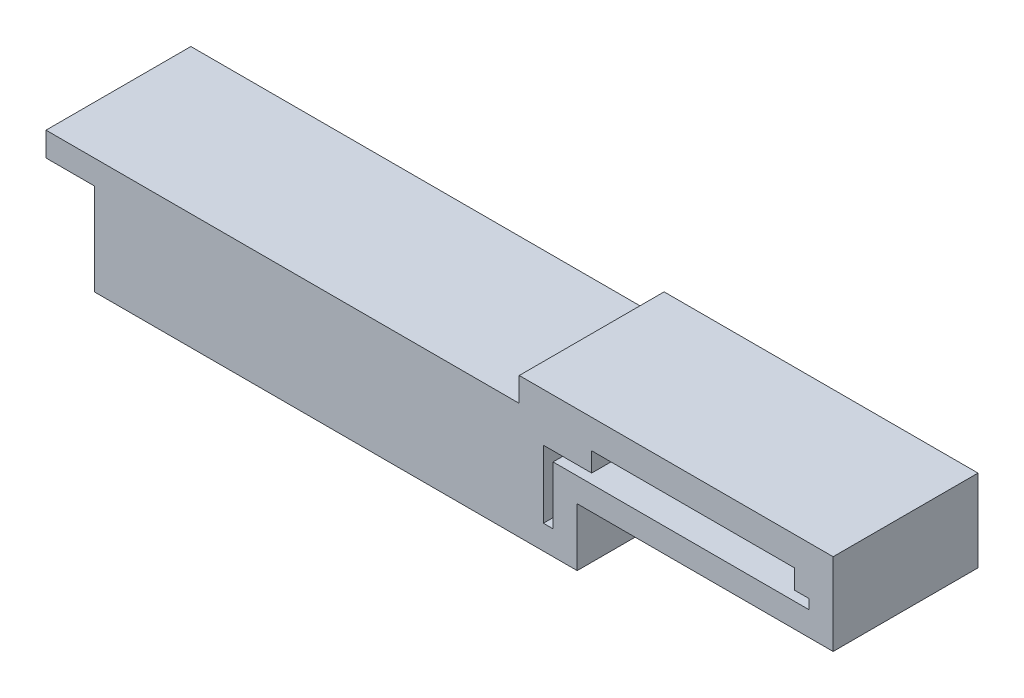
ISO-10303-21;
HEADER;
FILE_DESCRIPTION(('STEP AP214'),'2;1');
FILE_NAME('part.step','',(''),(''),'','','');
FILE_SCHEMA(('AUTOMOTIVE_DESIGN { 1 0 10303 214 1 1 1 1 }'));
ENDSEC;
DATA;
#1=APPLICATION_CONTEXT('core data for automotive mechanical design processes');
#2=APPLICATION_PROTOCOL_DEFINITION('international standard','automotive_design',2000,#1);
#3=PRODUCT_CONTEXT('',#1,'mechanical');
#4=PRODUCT('Part','Part','',(#3));
#5=PRODUCT_RELATED_PRODUCT_CATEGORY('part','',(#4));
#6=PRODUCT_DEFINITION_FORMATION('','',#4);
#7=PRODUCT_DEFINITION_CONTEXT('part definition',#1,'design');
#8=PRODUCT_DEFINITION('design','',#6,#7);
#9=PRODUCT_DEFINITION_SHAPE('','',#8);
#10=(LENGTH_UNIT() NAMED_UNIT(*) SI_UNIT(.MILLI.,.METRE.));
#11=(NAMED_UNIT(*) PLANE_ANGLE_UNIT() SI_UNIT($,.RADIAN.));
#12=(NAMED_UNIT(*) SI_UNIT($,.STERADIAN.) SOLID_ANGLE_UNIT());
#13=UNCERTAINTY_MEASURE_WITH_UNIT(LENGTH_MEASURE(1.E-05),#10,'distance_accuracy_value','');
#14=(GEOMETRIC_REPRESENTATION_CONTEXT(3) GLOBAL_UNCERTAINTY_ASSIGNED_CONTEXT((#13)) GLOBAL_UNIT_ASSIGNED_CONTEXT((#10,
#11,#12)) REPRESENTATION_CONTEXT('',''));
#15=CARTESIAN_POINT('',(0.,0.,0.));
#16=DIRECTION('',(0.,0.,1.));
#17=DIRECTION('',(1.,0.,0.));
#18=AXIS2_PLACEMENT_3D('',#15,#16,#17);
#19=CARTESIAN_POINT('',(10.,0.,30.));
#20=DIRECTION('',(1.,0.,0.));
#21=DIRECTION('',(0.,0.,-1.));
#22=AXIS2_PLACEMENT_3D('',#19,#20,#21);
#23=PLANE('',#22);
#24=DIRECTION('',(0.,-1.,0.));
#25=VECTOR('',#24,1.);
#26=CARTESIAN_POINT('',(10.,0.,0.));
#27=LINE('',#26,#25);
#28=CARTESIAN_POINT('',(10.,18.,0.));
#29=VERTEX_POINT('',#28);
#30=CARTESIAN_POINT('',(10.,14.,0.));
#31=VERTEX_POINT('',#30);
#32=EDGE_CURVE('E225',#29,#31,#27,.T.);
#33=ORIENTED_EDGE('',*,*,#32,.F.);
#34=DIRECTION('',(0.,0.,-1.));
#35=VECTOR('',#34,1.);
#36=CARTESIAN_POINT('',(10.,18.,30.));
#37=LINE('',#36,#35);
#38=CARTESIAN_POINT('',(10.,18.,30.));
#39=VERTEX_POINT('',#38);
#40=EDGE_CURVE('E11',#39,#29,#37,.T.);
#41=ORIENTED_EDGE('',*,*,#40,.F.);
#42=DIRECTION('',(0.,-1.,0.));
#43=VECTOR('',#42,1.);
#44=CARTESIAN_POINT('',(10.,0.,30.));
#45=LINE('',#44,#43);
#46=CARTESIAN_POINT('',(10.,14.,30.));
#47=VERTEX_POINT('',#46);
#48=EDGE_CURVE('E323',#39,#47,#45,.T.);
#49=ORIENTED_EDGE('',*,*,#48,.T.);
#50=DIRECTION('',(0.,0.,-1.));
#51=VECTOR('',#50,1.);
#52=CARTESIAN_POINT('',(10.,14.,30.));
#53=LINE('',#52,#51);
#54=EDGE_CURVE('E68',#47,#31,#53,.T.);
#55=ORIENTED_EDGE('',*,*,#54,.T.);
#56=EDGE_LOOP('',(#33,#41,#49,#55));
#57=FACE_BOUND('',#56,.T.);
#58=ADVANCED_FACE('F41',(#57),#23,.T.);
#59=CARTESIAN_POINT('',(0.,18.,30.));
#60=DIRECTION('',(0.,-1.,0.));
#61=DIRECTION('',(1.,0.,0.));
#62=AXIS2_PLACEMENT_3D('',#59,#60,#61);
#63=PLANE('',#62);
#64=DIRECTION('',(-1.,0.,0.));
#65=VECTOR('',#64,1.);
#66=CARTESIAN_POINT('',(0.,18.,0.));
#67=LINE('',#66,#65);
#68=CARTESIAN_POINT('',(52.,18.,0.));
#69=VERTEX_POINT('',#68);
#70=EDGE_CURVE('E228',#69,#29,#67,.T.);
#71=ORIENTED_EDGE('',*,*,#70,.F.);
#72=DIRECTION('',(0.,0.,-1.));
#73=VECTOR('',#72,1.);
#74=CARTESIAN_POINT('',(52.,18.,30.));
#75=LINE('',#74,#73);
#76=CARTESIAN_POINT('',(52.,18.,30.));
#77=VERTEX_POINT('',#76);
#78=EDGE_CURVE('E51',#77,#69,#75,.T.);
#79=ORIENTED_EDGE('',*,*,#78,.F.);
#80=DIRECTION('',(-1.,0.,0.));
#81=VECTOR('',#80,1.);
#82=CARTESIAN_POINT('',(0.,18.,30.));
#83=LINE('',#82,#81);
#84=EDGE_CURVE('E330',#77,#39,#83,.T.);
#85=ORIENTED_EDGE('',*,*,#84,.T.);
#86=ORIENTED_EDGE('',*,*,#40,.T.);
#87=EDGE_LOOP('',(#71,#79,#85,#86));
#88=FACE_BOUND('',#87,.T.);
#89=ADVANCED_FACE('F380',(#88),#63,.T.);
#90=CARTESIAN_POINT('',(52.,0.,30.));
#91=DIRECTION('',(-1.,0.,0.));
#92=DIRECTION('',(0.,0.,1.));
#93=AXIS2_PLACEMENT_3D('',#90,#91,#92);
#94=PLANE('',#93);
#95=DIRECTION('',(0.,1.,0.));
#96=VECTOR('',#95,1.);
#97=CARTESIAN_POINT('',(52.,0.,0.));
#98=LINE('',#97,#96);
#99=CARTESIAN_POINT('',(52.,14.,0.));
#100=VERTEX_POINT('',#99);
#101=EDGE_CURVE('E232',#100,#69,#98,.T.);
#102=ORIENTED_EDGE('',*,*,#101,.F.);
#103=DIRECTION('',(0.,0.,-1.));
#104=VECTOR('',#103,1.);
#105=CARTESIAN_POINT('',(52.,14.,30.));
#106=LINE('',#105,#104);
#107=CARTESIAN_POINT('',(52.,14.,30.));
#108=VERTEX_POINT('',#107);
#109=EDGE_CURVE('E273',#108,#100,#106,.T.);
#110=ORIENTED_EDGE('',*,*,#109,.F.);
#111=DIRECTION('',(0.,1.,0.));
#112=VECTOR('',#111,1.);
#113=CARTESIAN_POINT('',(52.,0.,30.));
#114=LINE('',#113,#112);
#115=EDGE_CURVE('E334',#108,#77,#114,.T.);
#116=ORIENTED_EDGE('',*,*,#115,.T.);
#117=ORIENTED_EDGE('',*,*,#78,.T.);
#118=EDGE_LOOP('',(#102,#110,#116,#117));
#119=FACE_BOUND('',#118,.T.);
#120=ADVANCED_FACE('F385',(#119),#94,.T.);
#121=CARTESIAN_POINT('',(0.,14.,30.));
#122=DIRECTION('',(0.,-1.,0.));
#123=DIRECTION('',(1.,0.,0.));
#124=AXIS2_PLACEMENT_3D('',#121,#122,#123);
#125=PLANE('',#124);
#126=DIRECTION('',(-1.,0.,0.));
#127=VECTOR('',#126,1.);
#128=CARTESIAN_POINT('',(0.,14.,0.));
#129=LINE('',#128,#127);
#130=CARTESIAN_POINT('',(55.,14.,0.));
#131=VERTEX_POINT('',#130);
#132=EDGE_CURVE('E236',#131,#100,#129,.T.);
#133=ORIENTED_EDGE('',*,*,#132,.F.);
#134=DIRECTION('',(0.,0.,-1.));
#135=VECTOR('',#134,1.);
#136=CARTESIAN_POINT('',(55.,14.,30.));
#137=LINE('',#136,#135);
#138=CARTESIAN_POINT('',(55.,14.,30.));
#139=VERTEX_POINT('',#138);
#140=EDGE_CURVE('E270',#139,#131,#137,.T.);
#141=ORIENTED_EDGE('',*,*,#140,.F.);
#142=DIRECTION('',(-1.,0.,0.));
#143=VECTOR('',#142,1.);
#144=CARTESIAN_POINT('',(0.,14.,30.));
#145=LINE('',#144,#143);
#146=EDGE_CURVE('E200',#139,#108,#145,.T.);
#147=ORIENTED_EDGE('',*,*,#146,.T.);
#148=ORIENTED_EDGE('',*,*,#109,.T.);
#149=EDGE_LOOP('',(#133,#141,#147,#148));
#150=FACE_BOUND('',#149,.T.);
#151=ADVANCED_FACE('F377',(#150),#125,.T.);
#152=CARTESIAN_POINT('',(55.,0.,30.));
#153=DIRECTION('',(-1.,0.,0.));
#154=DIRECTION('',(0.,0.,1.));
#155=AXIS2_PLACEMENT_3D('',#152,#153,#154);
#156=PLANE('',#155);
#157=DIRECTION('',(0.,1.,0.));
#158=VECTOR('',#157,1.);
#159=CARTESIAN_POINT('',(55.,0.,0.));
#160=LINE('',#159,#158);
#161=CARTESIAN_POINT('',(55.,12.,0.));
#162=VERTEX_POINT('',#161);
#163=EDGE_CURVE('E240',#162,#131,#160,.T.);
#164=ORIENTED_EDGE('',*,*,#163,.F.);
#165=DIRECTION('',(0.,0.,-1.));
#166=VECTOR('',#165,1.);
#167=CARTESIAN_POINT('',(55.,12.,30.));
#168=LINE('',#167,#166);
#169=CARTESIAN_POINT('',(55.,12.,30.));
#170=VERTEX_POINT('',#169);
#171=EDGE_CURVE('E267',#170,#162,#168,.T.);
#172=ORIENTED_EDGE('',*,*,#171,.F.);
#173=DIRECTION('',(0.,1.,0.));
#174=VECTOR('',#173,1.);
#175=CARTESIAN_POINT('',(55.,0.,30.));
#176=LINE('',#175,#174);
#177=EDGE_CURVE('E340',#170,#139,#176,.T.);
#178=ORIENTED_EDGE('',*,*,#177,.T.);
#179=ORIENTED_EDGE('',*,*,#140,.T.);
#180=EDGE_LOOP('',(#164,#172,#178,#179));
#181=FACE_BOUND('',#180,.T.);
#182=ADVANCED_FACE('F602',(#181),#156,.T.);
#183=CARTESIAN_POINT('',(0.,12.,30.));
#184=DIRECTION('',(0.,1.,0.));
#185=DIRECTION('',(-1.,0.,0.));
#186=AXIS2_PLACEMENT_3D('',#183,#184,#185);
#187=PLANE('',#186);
#188=DIRECTION('',(1.,0.,0.));
#189=VECTOR('',#188,1.);
#190=CARTESIAN_POINT('',(0.,12.,0.));
#191=LINE('',#190,#189);
#192=CARTESIAN_POINT('',(2.,12.,0.));
#193=VERTEX_POINT('',#192);
#194=EDGE_CURVE('E245',#193,#162,#191,.T.);
#195=ORIENTED_EDGE('',*,*,#194,.F.);
#196=DIRECTION('',(0.,0.,-1.));
#197=VECTOR('',#196,1.);
#198=CARTESIAN_POINT('',(2.,12.,30.));
#199=LINE('',#198,#197);
#200=CARTESIAN_POINT('',(2.,12.,30.));
#201=VERTEX_POINT('',#200);
#202=EDGE_CURVE('E264',#201,#193,#199,.T.);
#203=ORIENTED_EDGE('',*,*,#202,.F.);
#204=DIRECTION('',(1.,0.,0.));
#205=VECTOR('',#204,1.);
#206=CARTESIAN_POINT('',(0.,12.,30.));
#207=LINE('',#206,#205);
#208=EDGE_CURVE('E344',#201,#170,#207,.T.);
#209=ORIENTED_EDGE('',*,*,#208,.T.);
#210=ORIENTED_EDGE('',*,*,#171,.T.);
#211=EDGE_LOOP('',(#195,#203,#209,#210));
#212=FACE_BOUND('',#211,.T.);
#213=ADVANCED_FACE('F593',(#212),#187,.T.);
#214=CARTESIAN_POINT('',(2.,0.,30.));
#215=DIRECTION('',(-1.,0.,0.));
#216=DIRECTION('',(0.,0.,1.));
#217=AXIS2_PLACEMENT_3D('',#214,#215,#216);
#218=PLANE('',#217);
#219=DIRECTION('',(0.,1.,0.));
#220=VECTOR('',#219,1.);
#221=CARTESIAN_POINT('',(2.,0.,0.));
#222=LINE('',#221,#220);
#223=CARTESIAN_POINT('',(2.,0.,0.));
#224=VERTEX_POINT('',#223);
#225=EDGE_CURVE('E249',#224,#193,#222,.T.);
#226=ORIENTED_EDGE('',*,*,#225,.F.);
#227=DIRECTION('',(0.,0.,-1.));
#228=VECTOR('',#227,1.);
#229=CARTESIAN_POINT('',(2.,0.,30.));
#230=LINE('',#229,#228);
#231=CARTESIAN_POINT('',(2.,0.,30.));
#232=VERTEX_POINT('',#231);
#233=EDGE_CURVE('E178',#232,#224,#230,.T.);
#234=ORIENTED_EDGE('',*,*,#233,.F.);
#235=DIRECTION('',(0.,1.,0.));
#236=VECTOR('',#235,1.);
#237=CARTESIAN_POINT('',(2.,0.,30.));
#238=LINE('',#237,#236);
#239=EDGE_CURVE('E190',#232,#201,#238,.T.);
#240=ORIENTED_EDGE('',*,*,#239,.T.);
#241=ORIENTED_EDGE('',*,*,#202,.T.);
#242=EDGE_LOOP('',(#226,#234,#240,#241));
#243=FACE_BOUND('',#242,.T.);
#244=ADVANCED_FACE('F350',(#243),#218,.T.);
#245=CARTESIAN_POINT('',(0.,0.,30.));
#246=DIRECTION('',(0.,1.,0.));
#247=DIRECTION('',(0.,0.,1.));
#248=AXIS2_PLACEMENT_3D('',#245,#246,#247);
#249=PLANE('',#248);
#250=DIRECTION('',(1.,0.,0.));
#251=VECTOR('',#250,1.);
#252=CARTESIAN_POINT('',(0.,0.,0.));
#253=LINE('',#252,#251);
#254=CARTESIAN_POINT('',(0.,0.,0.));
#255=VERTEX_POINT('',#254);
#256=EDGE_CURVE('E172',#255,#224,#253,.T.);
#257=ORIENTED_EDGE('',*,*,#256,.F.);
#258=DIRECTION('',(0.,0.,-1.));
#259=VECTOR('',#258,1.);
#260=CARTESIAN_POINT('',(0.,0.,30.));
#261=LINE('',#260,#259);
#262=CARTESIAN_POINT('',(0.,0.,30.));
#263=VERTEX_POINT('',#262);
#264=EDGE_CURVE('E167',#263,#255,#261,.T.);
#265=ORIENTED_EDGE('',*,*,#264,.F.);
#266=DIRECTION('',(1.,0.,0.));
#267=VECTOR('',#266,1.);
#268=CARTESIAN_POINT('',(0.,0.,30.));
#269=LINE('',#268,#267);
#270=EDGE_CURVE('E170',#263,#232,#269,.T.);
#271=ORIENTED_EDGE('',*,*,#270,.T.);
#272=ORIENTED_EDGE('',*,*,#233,.T.);
#273=EDGE_LOOP('',(#257,#265,#271,#272));
#274=FACE_BOUND('',#273,.T.);
#275=ADVANCED_FACE('F169',(#274),#249,.T.);
#276=CARTESIAN_POINT('',(0.,0.,30.));
#277=DIRECTION('',(1.,0.,0.));
#278=DIRECTION('',(0.,1.,0.));
#279=AXIS2_PLACEMENT_3D('',#276,#277,#278);
#280=PLANE('',#279);
#281=DIRECTION('',(0.,-1.,0.));
#282=VECTOR('',#281,1.);
#283=CARTESIAN_POINT('',(0.,0.,0.));
#284=LINE('',#283,#282);
#285=CARTESIAN_POINT('',(0.,14.,0.));
#286=VERTEX_POINT('',#285);
#287=EDGE_CURVE('E255',#286,#255,#284,.T.);
#288=ORIENTED_EDGE('',*,*,#287,.F.);
#289=DIRECTION('',(0.,0.,-1.));
#290=VECTOR('',#289,1.);
#291=CARTESIAN_POINT('',(0.,14.,30.));
#292=LINE('',#291,#290);
#293=CARTESIAN_POINT('',(0.,14.,30.));
#294=VERTEX_POINT('',#293);
#295=EDGE_CURVE('E179',#294,#286,#292,.T.);
#296=ORIENTED_EDGE('',*,*,#295,.F.);
#297=DIRECTION('',(0.,-1.,0.));
#298=VECTOR('',#297,1.);
#299=CARTESIAN_POINT('',(0.,0.,30.));
#300=LINE('',#299,#298);
#301=EDGE_CURVE('E187',#294,#263,#300,.T.);
#302=ORIENTED_EDGE('',*,*,#301,.T.);
#303=ORIENTED_EDGE('',*,*,#264,.T.);
#304=EDGE_LOOP('',(#288,#296,#302,#303));
#305=FACE_BOUND('',#304,.T.);
#306=ADVANCED_FACE('F193',(#305),#280,.T.);
#307=CARTESIAN_POINT('',(-5.,0.,30.));
#308=DIRECTION('',(-1.,0.,0.));
#309=DIRECTION('',(0.,0.,1.));
#310=AXIS2_PLACEMENT_3D('',#307,#308,#309);
#311=PLANE('',#310);
#312=DIRECTION('',(0.,0.,-1.));
#313=VECTOR('',#312,1.);
#314=CARTESIAN_POINT('',(-5.,19.,30.));
#315=LINE('',#314,#313);
#316=CARTESIAN_POINT('',(-5.,19.,30.));
#317=VERTEX_POINT('',#316);
#318=CARTESIAN_POINT('',(-5.,19.,0.));
#319=VERTEX_POINT('',#318);
#320=EDGE_CURVE('E59',#317,#319,#315,.T.);
#321=ORIENTED_EDGE('',*,*,#320,.F.);
#322=DIRECTION('',(0.,1.,0.));
#323=VECTOR('',#322,1.);
#324=CARTESIAN_POINT('',(-5.,0.,30.));
#325=LINE('',#324,#323);
#326=CARTESIAN_POINT('',(-5.,24.,30.));
#327=VERTEX_POINT('',#326);
#328=EDGE_CURVE('E354',#317,#327,#325,.T.);
#329=ORIENTED_EDGE('',*,*,#328,.T.);
#330=DIRECTION('',(0.,0.,-1.));
#331=VECTOR('',#330,1.);
#332=CARTESIAN_POINT('',(-5.,24.,30.));
#333=LINE('',#332,#331);
#334=CARTESIAN_POINT('',(-5.,24.,0.));
#335=VERTEX_POINT('',#334);
#336=EDGE_CURVE('E198',#327,#335,#333,.T.);
#337=ORIENTED_EDGE('',*,*,#336,.T.);
#338=DIRECTION('',(0.,1.,0.));
#339=VECTOR('',#338,1.);
#340=CARTESIAN_POINT('',(-5.,0.,0.));
#341=LINE('',#340,#339);
#342=EDGE_CURVE('E203',#319,#335,#341,.T.);
#343=ORIENTED_EDGE('',*,*,#342,.F.);
#344=EDGE_LOOP('',(#321,#329,#337,#343));
#345=FACE_BOUND('',#344,.T.);
#346=ADVANCED_FACE('F43',(#345),#311,.T.);
#347=CARTESIAN_POINT('',(0.,-5.,30.));
#348=DIRECTION('',(0.,1.,0.));
#349=DIRECTION('',(0.,0.,1.));
#350=AXIS2_PLACEMENT_3D('',#347,#348,#349);
#351=PLANE('',#350);
#352=DIRECTION('',(1.,0.,0.));
#353=VECTOR('',#352,1.);
#354=CARTESIAN_POINT('',(0.,-5.,0.));
#355=LINE('',#354,#353);
#356=CARTESIAN_POINT('',(-93.,-5.,0.));
#357=VERTEX_POINT('',#356);
#358=CARTESIAN_POINT('',(7.,-5.,0.));
#359=VERTEX_POINT('',#358);
#360=EDGE_CURVE('E206',#357,#359,#355,.T.);
#361=ORIENTED_EDGE('',*,*,#360,.T.);
#362=DIRECTION('',(0.,0.,-1.));
#363=VECTOR('',#362,1.);
#364=CARTESIAN_POINT('',(7.,-5.,30.));
#365=LINE('',#364,#363);
#366=CARTESIAN_POINT('',(7.,-5.,30.));
#367=VERTEX_POINT('',#366);
#368=EDGE_CURVE('E45',#367,#359,#365,.T.);
#369=ORIENTED_EDGE('',*,*,#368,.F.);
#370=DIRECTION('',(1.,0.,0.));
#371=VECTOR('',#370,1.);
#372=CARTESIAN_POINT('',(0.,-5.,30.));
#373=LINE('',#372,#371);
#374=CARTESIAN_POINT('',(-93.,-5.,30.));
#375=VERTEX_POINT('',#374);
#376=EDGE_CURVE('E128',#375,#367,#373,.T.);
#377=ORIENTED_EDGE('',*,*,#376,.F.);
#378=DIRECTION('',(0.,0.,-1.));
#379=VECTOR('',#378,1.);
#380=CARTESIAN_POINT('',(-93.,-5.,30.));
#381=LINE('',#380,#379);
#382=EDGE_CURVE('E207',#375,#357,#381,.T.);
#383=ORIENTED_EDGE('',*,*,#382,.T.);
#384=EDGE_LOOP('',(#361,#369,#377,#383));
#385=FACE_BOUND('',#384,.T.);
#386=ADVANCED_FACE('F398',(#385),#351,.F.);
#387=CARTESIAN_POINT('',(7.,0.,30.));
#388=DIRECTION('',(-1.,0.,0.));
#389=DIRECTION('',(0.,-1.,0.));
#390=AXIS2_PLACEMENT_3D('',#387,#388,#389);
#391=PLANE('',#390);
#392=DIRECTION('',(0.,1.,0.));
#393=VECTOR('',#392,1.);
#394=CARTESIAN_POINT('',(7.,0.,0.));
#395=LINE('',#394,#393);
#396=CARTESIAN_POINT('',(7.,7.00000000000001,0.));
#397=VERTEX_POINT('',#396);
#398=EDGE_CURVE('E210',#359,#397,#395,.T.);
#399=ORIENTED_EDGE('',*,*,#398,.T.);
#400=DIRECTION('',(0.,0.,-1.));
#401=VECTOR('',#400,1.);
#402=CARTESIAN_POINT('',(7.,7.00000000000001,30.));
#403=LINE('',#402,#401);
#404=CARTESIAN_POINT('',(7.,7.00000000000001,30.));
#405=VERTEX_POINT('',#404);
#406=EDGE_CURVE('E286',#405,#397,#403,.T.);
#407=ORIENTED_EDGE('',*,*,#406,.F.);
#408=DIRECTION('',(0.,1.,0.));
#409=VECTOR('',#408,1.);
#410=CARTESIAN_POINT('',(7.,0.,30.));
#411=LINE('',#410,#409);
#412=EDGE_CURVE('E299',#367,#405,#411,.T.);
#413=ORIENTED_EDGE('',*,*,#412,.F.);
#414=ORIENTED_EDGE('',*,*,#368,.T.);
#415=EDGE_LOOP('',(#399,#407,#413,#414));
#416=FACE_BOUND('',#415,.T.);
#417=ADVANCED_FACE('F298',(#416),#391,.F.);
#418=CARTESIAN_POINT('',(0.,7.00000000000001,30.));
#419=DIRECTION('',(0.,1.,0.));
#420=DIRECTION('',(0.,0.,1.));
#421=AXIS2_PLACEMENT_3D('',#418,#419,#420);
#422=PLANE('',#421);
#423=DIRECTION('',(1.,0.,0.));
#424=VECTOR('',#423,1.);
#425=CARTESIAN_POINT('',(0.,7.00000000000001,0.));
#426=LINE('',#425,#424);
#427=CARTESIAN_POINT('',(60.,7.00000000000001,0.));
#428=VERTEX_POINT('',#427);
#429=EDGE_CURVE('E213',#397,#428,#426,.T.);
#430=ORIENTED_EDGE('',*,*,#429,.T.);
#431=DIRECTION('',(0.,0.,-1.));
#432=VECTOR('',#431,1.);
#433=CARTESIAN_POINT('',(60.,7.00000000000001,30.));
#434=LINE('',#433,#432);
#435=CARTESIAN_POINT('',(60.,7.00000000000001,30.));
#436=VERTEX_POINT('',#435);
#437=EDGE_CURVE('E284',#436,#428,#434,.T.);
#438=ORIENTED_EDGE('',*,*,#437,.F.);
#439=DIRECTION('',(1.,0.,0.));
#440=VECTOR('',#439,1.);
#441=CARTESIAN_POINT('',(0.,7.00000000000001,30.));
#442=LINE('',#441,#440);
#443=EDGE_CURVE('E311',#405,#436,#442,.T.);
#444=ORIENTED_EDGE('',*,*,#443,.F.);
#445=ORIENTED_EDGE('',*,*,#406,.T.);
#446=EDGE_LOOP('',(#430,#438,#444,#445));
#447=FACE_BOUND('',#446,.T.);
#448=ADVANCED_FACE('F309',(#447),#422,.F.);
#449=CARTESIAN_POINT('',(60.,0.,30.));
#450=DIRECTION('',(1.,0.,0.));
#451=DIRECTION('',(0.,0.,-1.));
#452=AXIS2_PLACEMENT_3D('',#449,#450,#451);
#453=PLANE('',#452);
#454=DIRECTION('',(0.,-1.,0.));
#455=VECTOR('',#454,1.);
#456=CARTESIAN_POINT('',(60.,0.,0.));
#457=LINE('',#456,#455);
#458=CARTESIAN_POINT('',(60.,24.,0.));
#459=VERTEX_POINT('',#458);
#460=EDGE_CURVE('E217',#459,#428,#457,.T.);
#461=ORIENTED_EDGE('',*,*,#460,.F.);
#462=DIRECTION('',(0.,0.,-1.));
#463=VECTOR('',#462,1.);
#464=CARTESIAN_POINT('',(60.,24.,30.));
#465=LINE('',#464,#463);
#466=CARTESIAN_POINT('',(60.,24.,30.));
#467=VERTEX_POINT('',#466);
#468=EDGE_CURVE('E281',#467,#459,#465,.T.);
#469=ORIENTED_EDGE('',*,*,#468,.F.);
#470=DIRECTION('',(0.,-1.,0.));
#471=VECTOR('',#470,1.);
#472=CARTESIAN_POINT('',(60.,0.,30.));
#473=LINE('',#472,#471);
#474=EDGE_CURVE('E314',#467,#436,#473,.T.);
#475=ORIENTED_EDGE('',*,*,#474,.T.);
#476=ORIENTED_EDGE('',*,*,#437,.T.);
#477=EDGE_LOOP('',(#461,#469,#475,#476));
#478=FACE_BOUND('',#477,.T.);
#479=ADVANCED_FACE('F315',(#478),#453,.T.);
#480=CARTESIAN_POINT('',(0.,24.,30.));
#481=DIRECTION('',(0.,1.,0.));
#482=DIRECTION('',(0.,0.,1.));
#483=AXIS2_PLACEMENT_3D('',#480,#481,#482);
#484=PLANE('',#483);
#485=DIRECTION('',(1.,0.,0.));
#486=VECTOR('',#485,1.);
#487=CARTESIAN_POINT('',(0.,24.,0.));
#488=LINE('',#487,#486);
#489=EDGE_CURVE('E221',#335,#459,#488,.T.);
#490=ORIENTED_EDGE('',*,*,#489,.F.);
#491=ORIENTED_EDGE('',*,*,#336,.F.);
#492=DIRECTION('',(1.,0.,0.));
#493=VECTOR('',#492,1.);
#494=CARTESIAN_POINT('',(0.,24.,30.));
#495=LINE('',#494,#493);
#496=EDGE_CURVE('E319',#327,#467,#495,.T.);
#497=ORIENTED_EDGE('',*,*,#496,.T.);
#498=ORIENTED_EDGE('',*,*,#468,.T.);
#499=EDGE_LOOP('',(#490,#491,#497,#498));
#500=FACE_BOUND('',#499,.T.);
#501=ADVANCED_FACE('F375',(#500),#484,.T.);
#502=EDGE_CURVE('E241',#31,#286,#129,.T.);
#503=ORIENTED_EDGE('',*,*,#502,.F.);
#504=ORIENTED_EDGE('',*,*,#54,.F.);
#505=EDGE_CURVE('E195',#47,#294,#145,.T.);
#506=ORIENTED_EDGE('',*,*,#505,.T.);
#507=ORIENTED_EDGE('',*,*,#295,.T.);
#508=EDGE_LOOP('',(#503,#504,#506,#507));
#509=FACE_BOUND('',#508,.T.);
#510=ADVANCED_FACE('F367',(#509),#125,.T.);
#511=CARTESIAN_POINT('',(0.,0.,30.));
#512=DIRECTION('',(0.,0.,1.));
#513=DIRECTION('',(1.,0.,0.));
#514=AXIS2_PLACEMENT_3D('',#511,#512,#513);
#515=PLANE('',#514);
#516=ORIENTED_EDGE('',*,*,#328,.F.);
#517=DIRECTION('',(-1.,0.,0.));
#518=VECTOR('',#517,1.);
#519=CARTESIAN_POINT('',(0.,19.,30.));
#520=LINE('',#519,#518);
#521=CARTESIAN_POINT('',(-103.,19.,30.));
#522=VERTEX_POINT('',#521);
#523=EDGE_CURVE('E424',#317,#522,#520,.T.);
#524=ORIENTED_EDGE('',*,*,#523,.T.);
#525=DIRECTION('',(0.,-1.,0.));
#526=VECTOR('',#525,1.);
#527=CARTESIAN_POINT('',(-103.,0.,30.));
#528=LINE('',#527,#526);
#529=CARTESIAN_POINT('',(-103.,14.,30.));
#530=VERTEX_POINT('',#529);
#531=EDGE_CURVE('E449',#522,#530,#528,.T.);
#532=ORIENTED_EDGE('',*,*,#531,.T.);
#533=DIRECTION('',(-1.,0.,0.));
#534=VECTOR('',#533,1.);
#535=CARTESIAN_POINT('',(0.,14.,30.));
#536=LINE('',#535,#534);
#537=CARTESIAN_POINT('',(-93.,14.,30.));
#538=VERTEX_POINT('',#537);
#539=EDGE_CURVE('E454',#538,#530,#536,.T.);
#540=ORIENTED_EDGE('',*,*,#539,.F.);
#541=DIRECTION('',(0.,-1.,0.));
#542=VECTOR('',#541,1.);
#543=CARTESIAN_POINT('',(-93.,0.,30.));
#544=LINE('',#543,#542);
#545=EDGE_CURVE('E433',#538,#375,#544,.T.);
#546=ORIENTED_EDGE('',*,*,#545,.T.);
#547=ORIENTED_EDGE('',*,*,#376,.T.);
#548=ORIENTED_EDGE('',*,*,#412,.T.);
#549=ORIENTED_EDGE('',*,*,#443,.T.);
#550=ORIENTED_EDGE('',*,*,#474,.F.);
#551=ORIENTED_EDGE('',*,*,#496,.F.);
#552=EDGE_LOOP('',(#516,#524,#532,#540,#546,#547,#548,#549,#550,#551));
#553=FACE_BOUND('',#552,.T.);
#554=ORIENTED_EDGE('',*,*,#48,.F.);
#555=ORIENTED_EDGE('',*,*,#84,.F.);
#556=ORIENTED_EDGE('',*,*,#115,.F.);
#557=ORIENTED_EDGE('',*,*,#146,.F.);
#558=ORIENTED_EDGE('',*,*,#177,.F.);
#559=ORIENTED_EDGE('',*,*,#208,.F.);
#560=ORIENTED_EDGE('',*,*,#239,.F.);
#561=ORIENTED_EDGE('',*,*,#270,.F.);
#562=ORIENTED_EDGE('',*,*,#301,.F.);
#563=ORIENTED_EDGE('',*,*,#505,.F.);
#564=EDGE_LOOP('',(#554,#555,#556,#557,#558,#559,#560,#561,#562,#563));
#565=FACE_BOUND('',#564,.T.);
#566=ADVANCED_FACE('F185',(#553,#565),#515,.T.);
#567=CARTESIAN_POINT('',(0.,0.,0.));
#568=DIRECTION('',(0.,0.,1.));
#569=DIRECTION('',(1.,0.,0.));
#570=AXIS2_PLACEMENT_3D('',#567,#568,#569);
#571=PLANE('',#570);
#572=ORIENTED_EDGE('',*,*,#360,.F.);
#573=DIRECTION('',(0.,-1.,0.));
#574=VECTOR('',#573,1.);
#575=CARTESIAN_POINT('',(-93.,0.,0.));
#576=LINE('',#575,#574);
#577=CARTESIAN_POINT('',(-93.,14.,0.));
#578=VERTEX_POINT('',#577);
#579=EDGE_CURVE('E412',#578,#357,#576,.T.);
#580=ORIENTED_EDGE('',*,*,#579,.F.);
#581=DIRECTION('',(-1.,0.,0.));
#582=VECTOR('',#581,1.);
#583=CARTESIAN_POINT('',(0.,14.,0.));
#584=LINE('',#583,#582);
#585=CARTESIAN_POINT('',(-103.,14.,0.));
#586=VERTEX_POINT('',#585);
#587=EDGE_CURVE('E418',#578,#586,#584,.T.);
#588=ORIENTED_EDGE('',*,*,#587,.T.);
#589=DIRECTION('',(0.,-1.,0.));
#590=VECTOR('',#589,1.);
#591=CARTESIAN_POINT('',(-103.,0.,0.));
#592=LINE('',#591,#590);
#593=CARTESIAN_POINT('',(-103.,19.,0.));
#594=VERTEX_POINT('',#593);
#595=EDGE_CURVE('E421',#594,#586,#592,.T.);
#596=ORIENTED_EDGE('',*,*,#595,.F.);
#597=DIRECTION('',(-1.,0.,0.));
#598=VECTOR('',#597,1.);
#599=CARTESIAN_POINT('',(0.,19.,0.));
#600=LINE('',#599,#598);
#601=EDGE_CURVE('E430',#319,#594,#600,.T.);
#602=ORIENTED_EDGE('',*,*,#601,.F.);
#603=ORIENTED_EDGE('',*,*,#342,.T.);
#604=ORIENTED_EDGE('',*,*,#489,.T.);
#605=ORIENTED_EDGE('',*,*,#460,.T.);
#606=ORIENTED_EDGE('',*,*,#429,.F.);
#607=ORIENTED_EDGE('',*,*,#398,.F.);
#608=EDGE_LOOP('',(#572,#580,#588,#596,#602,#603,#604,#605,#606,#607));
#609=FACE_BOUND('',#608,.T.);
#610=ORIENTED_EDGE('',*,*,#32,.T.);
#611=ORIENTED_EDGE('',*,*,#502,.T.);
#612=ORIENTED_EDGE('',*,*,#287,.T.);
#613=ORIENTED_EDGE('',*,*,#256,.T.);
#614=ORIENTED_EDGE('',*,*,#225,.T.);
#615=ORIENTED_EDGE('',*,*,#194,.T.);
#616=ORIENTED_EDGE('',*,*,#163,.T.);
#617=ORIENTED_EDGE('',*,*,#132,.T.);
#618=ORIENTED_EDGE('',*,*,#101,.T.);
#619=ORIENTED_EDGE('',*,*,#70,.T.);
#620=EDGE_LOOP('',(#610,#611,#612,#613,#614,#615,#616,#617,#618,#619));
#621=FACE_BOUND('',#620,.T.);
#622=ADVANCED_FACE('F303',(#609,#621),#571,.F.);
#623=CARTESIAN_POINT('',(-93.,0.,30.));
#624=DIRECTION('',(1.,0.,0.));
#625=DIRECTION('',(0.,0.,-1.));
#626=AXIS2_PLACEMENT_3D('',#623,#624,#625);
#627=PLANE('',#626);
#628=ORIENTED_EDGE('',*,*,#579,.T.);
#629=ORIENTED_EDGE('',*,*,#382,.F.);
#630=ORIENTED_EDGE('',*,*,#545,.F.);
#631=DIRECTION('',(0.,0.,-1.));
#632=VECTOR('',#631,1.);
#633=CARTESIAN_POINT('',(-93.,14.,30.));
#634=LINE('',#633,#632);
#635=EDGE_CURVE('E361',#538,#578,#634,.T.);
#636=ORIENTED_EDGE('',*,*,#635,.T.);
#637=EDGE_LOOP('',(#628,#629,#630,#636));
#638=FACE_BOUND('',#637,.T.);
#639=ADVANCED_FACE('F373',(#638),#627,.F.);
#640=CARTESIAN_POINT('',(0.,19.,30.));
#641=DIRECTION('',(0.,-1.,0.));
#642=DIRECTION('',(0.,0.,-1.));
#643=AXIS2_PLACEMENT_3D('',#640,#641,#642);
#644=PLANE('',#643);
#645=ORIENTED_EDGE('',*,*,#601,.T.);
#646=DIRECTION('',(0.,0.,-1.));
#647=VECTOR('',#646,1.);
#648=CARTESIAN_POINT('',(-103.,19.,30.));
#649=LINE('',#648,#647);
#650=EDGE_CURVE('E437',#522,#594,#649,.T.);
#651=ORIENTED_EDGE('',*,*,#650,.F.);
#652=ORIENTED_EDGE('',*,*,#523,.F.);
#653=ORIENTED_EDGE('',*,*,#320,.T.);
#654=EDGE_LOOP('',(#645,#651,#652,#653));
#655=FACE_BOUND('',#654,.T.);
#656=ADVANCED_FACE('F473',(#655),#644,.F.);
#657=CARTESIAN_POINT('',(-103.,0.,30.));
#658=DIRECTION('',(1.,0.,0.));
#659=DIRECTION('',(0.,0.,-1.));
#660=AXIS2_PLACEMENT_3D('',#657,#658,#659);
#661=PLANE('',#660);
#662=ORIENTED_EDGE('',*,*,#595,.T.);
#663=DIRECTION('',(0.,0.,-1.));
#664=VECTOR('',#663,1.);
#665=CARTESIAN_POINT('',(-103.,14.,30.));
#666=LINE('',#665,#664);
#667=EDGE_CURVE('E440',#530,#586,#666,.T.);
#668=ORIENTED_EDGE('',*,*,#667,.F.);
#669=ORIENTED_EDGE('',*,*,#531,.F.);
#670=ORIENTED_EDGE('',*,*,#650,.T.);
#671=EDGE_LOOP('',(#662,#668,#669,#670));
#672=FACE_BOUND('',#671,.T.);
#673=ADVANCED_FACE('F476',(#672),#661,.F.);
#674=CARTESIAN_POINT('',(0.,14.,30.));
#675=DIRECTION('',(0.,-1.,0.));
#676=DIRECTION('',(0.,0.,-1.));
#677=AXIS2_PLACEMENT_3D('',#674,#675,#676);
#678=PLANE('',#677);
#679=ORIENTED_EDGE('',*,*,#587,.F.);
#680=ORIENTED_EDGE('',*,*,#635,.F.);
#681=ORIENTED_EDGE('',*,*,#539,.T.);
#682=ORIENTED_EDGE('',*,*,#667,.T.);
#683=EDGE_LOOP('',(#679,#680,#681,#682));
#684=FACE_BOUND('',#683,.T.);
#685=ADVANCED_FACE('F477',(#684),#678,.T.);
#686=CLOSED_SHELL('',(#58,#89,#120,#151,#182,#213,#244,#275,#306,#346,#386,#417,#448,#479,#501,
#510,#566,#622,#639,#656,#673,#685));
#687=MANIFOLD_SOLID_BREP('B2',#686);
#688=ADVANCED_BREP_SHAPE_REPRESENTATION('',(#18,#687),#14);
#689=SHAPE_DEFINITION_REPRESENTATION(#9,#688);
ENDSEC;
END-ISO-10303-21;
